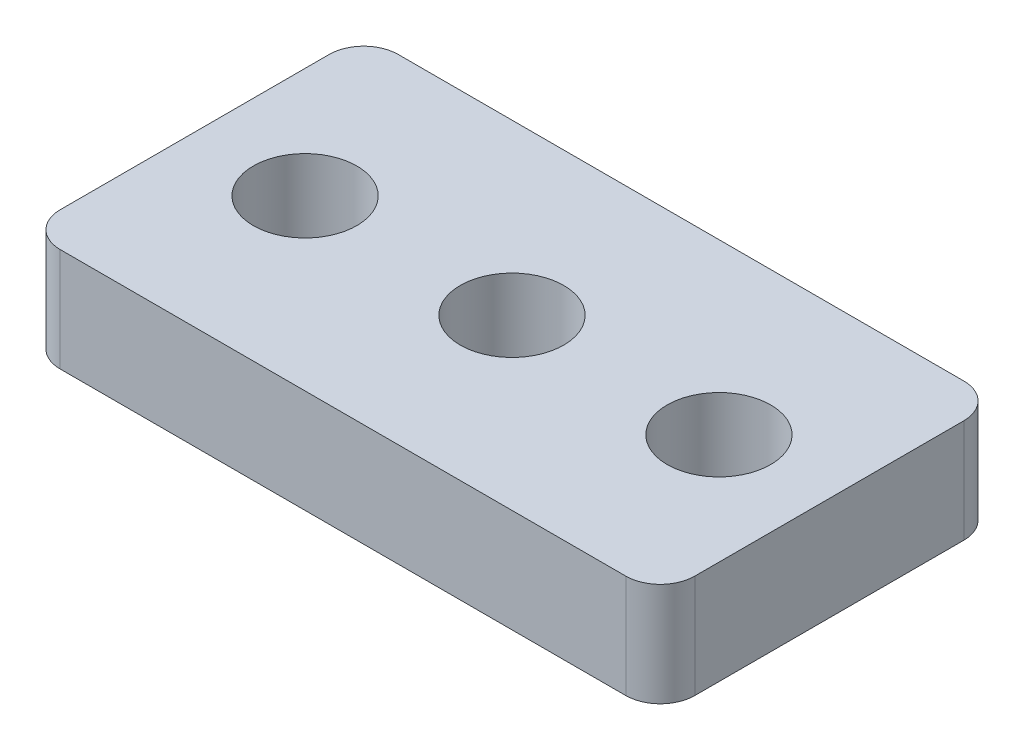
ISO-10303-21;
HEADER;
FILE_DESCRIPTION(('STEP AP214'),'2;1');
FILE_NAME('part.step','',(''),(''),'','','');
FILE_SCHEMA(('AUTOMOTIVE_DESIGN { 1 0 10303 214 1 1 1 1 }'));
ENDSEC;
DATA;
#1=APPLICATION_CONTEXT('core data for automotive mechanical design processes');
#2=APPLICATION_PROTOCOL_DEFINITION('international standard','automotive_design',2000,#1);
#3=PRODUCT_CONTEXT('',#1,'mechanical');
#4=PRODUCT('Part','Part','',(#3));
#5=PRODUCT_RELATED_PRODUCT_CATEGORY('part','',(#4));
#6=PRODUCT_DEFINITION_FORMATION('','',#4);
#7=PRODUCT_DEFINITION_CONTEXT('part definition',#1,'design');
#8=PRODUCT_DEFINITION('design','',#6,#7);
#9=PRODUCT_DEFINITION_SHAPE('','',#8);
#10=(LENGTH_UNIT() NAMED_UNIT(*) SI_UNIT(.MILLI.,.METRE.));
#11=(NAMED_UNIT(*) PLANE_ANGLE_UNIT() SI_UNIT($,.RADIAN.));
#12=(NAMED_UNIT(*) SI_UNIT($,.STERADIAN.) SOLID_ANGLE_UNIT());
#13=UNCERTAINTY_MEASURE_WITH_UNIT(LENGTH_MEASURE(1.E-05),#10,'distance_accuracy_value','');
#14=(GEOMETRIC_REPRESENTATION_CONTEXT(3) GLOBAL_UNCERTAINTY_ASSIGNED_CONTEXT((#13)) GLOBAL_UNIT_ASSIGNED_CONTEXT((#10,
#11,#12)) REPRESENTATION_CONTEXT('',''));
#15=CARTESIAN_POINT('',(0.,0.,0.));
#16=DIRECTION('',(0.,0.,1.));
#17=DIRECTION('',(1.,0.,0.));
#18=AXIS2_PLACEMENT_3D('',#15,#16,#17);
#19=CARTESIAN_POINT('',(0.,3.,0.));
#20=DIRECTION('',(0.,1.,0.));
#21=DIRECTION('',(0.,0.,1.));
#22=AXIS2_PLACEMENT_3D('',#19,#20,#21);
#23=PLANE('',#22);
#24=CARTESIAN_POINT('',(0.,3.,0.));
#25=DIRECTION('',(0.,1.,0.));
#26=DIRECTION('',(0.,0.,1.));
#27=AXIS2_PLACEMENT_3D('',#24,#25,#26);
#28=CIRCLE('',#27,1.5);
#29=CARTESIAN_POINT('',(0.,3.,1.5));
#30=VERTEX_POINT('',#29);
#31=EDGE_CURVE('E186',#30,#30,#28,.T.);
#32=ORIENTED_EDGE('',*,*,#31,.F.);
#33=EDGE_LOOP('',(#32));
#34=FACE_BOUND('',#33,.T.);
#35=DIRECTION('',(0.,0.,1.));
#36=VECTOR('',#35,1.);
#37=CARTESIAN_POINT('',(-9.2,3.,-4.89999990463257));
#38=LINE('',#37,#36);
#39=CARTESIAN_POINT('',(-9.2,3.,-3.89999990463257));
#40=VERTEX_POINT('',#39);
#41=CARTESIAN_POINT('',(-9.2,3.,3.89999990463257));
#42=VERTEX_POINT('',#41);
#43=EDGE_CURVE('E172',#40,#42,#38,.T.);
#44=ORIENTED_EDGE('',*,*,#43,.T.);
#45=CARTESIAN_POINT('',(-8.2,3.,3.89999990463257));
#46=DIRECTION('',(0.,1.,0.));
#47=DIRECTION('',(0.,0.,1.));
#48=AXIS2_PLACEMENT_3D('',#45,#46,#47);
#49=CIRCLE('',#48,1.);
#50=CARTESIAN_POINT('',(-8.2,3.,4.89999990463257));
#51=VERTEX_POINT('',#50);
#52=EDGE_CURVE('E153',#42,#51,#49,.T.);
#53=ORIENTED_EDGE('',*,*,#52,.T.);
#54=DIRECTION('',(1.,0.,0.));
#55=VECTOR('',#54,1.);
#56=CARTESIAN_POINT('',(-9.2,3.,4.89999990463257));
#57=LINE('',#56,#55);
#58=CARTESIAN_POINT('',(8.2,3.,4.89999990463257));
#59=VERTEX_POINT('',#58);
#60=EDGE_CURVE('E123',#51,#59,#57,.T.);
#61=ORIENTED_EDGE('',*,*,#60,.T.);
#62=CARTESIAN_POINT('',(8.2,3.,3.89999990463257));
#63=DIRECTION('',(0.,1.,0.));
#64=DIRECTION('',(0.,0.,1.));
#65=AXIS2_PLACEMENT_3D('',#62,#63,#64);
#66=CIRCLE('',#65,1.);
#67=CARTESIAN_POINT('',(9.2,3.,3.89999990463257));
#68=VERTEX_POINT('',#67);
#69=EDGE_CURVE('E59',#59,#68,#66,.T.);
#70=ORIENTED_EDGE('',*,*,#69,.T.);
#71=DIRECTION('',(0.,0.,-1.));
#72=VECTOR('',#71,1.);
#73=CARTESIAN_POINT('',(9.2,3.,4.89999990463257));
#74=LINE('',#73,#72);
#75=CARTESIAN_POINT('',(9.2,3.,-3.89999990463256));
#76=VERTEX_POINT('',#75);
#77=EDGE_CURVE('E139',#68,#76,#74,.T.);
#78=ORIENTED_EDGE('',*,*,#77,.T.);
#79=CARTESIAN_POINT('',(8.2,3.,-3.89999990463257));
#80=DIRECTION('',(0.,1.,0.));
#81=DIRECTION('',(0.,0.,1.));
#82=AXIS2_PLACEMENT_3D('',#79,#80,#81);
#83=CIRCLE('',#82,1.);
#84=CARTESIAN_POINT('',(8.2,3.,-4.89999990463257));
#85=VERTEX_POINT('',#84);
#86=EDGE_CURVE('E150',#76,#85,#83,.T.);
#87=ORIENTED_EDGE('',*,*,#86,.T.);
#88=DIRECTION('',(-1.,0.,0.));
#89=VECTOR('',#88,1.);
#90=CARTESIAN_POINT('',(9.2,3.,-4.89999990463257));
#91=LINE('',#90,#89);
#92=CARTESIAN_POINT('',(-8.2,3.,-4.89999990463257));
#93=VERTEX_POINT('',#92);
#94=EDGE_CURVE('E133',#85,#93,#91,.T.);
#95=ORIENTED_EDGE('',*,*,#94,.T.);
#96=CARTESIAN_POINT('',(-8.2,3.,-3.89999990463257));
#97=DIRECTION('',(0.,1.,0.));
#98=DIRECTION('',(0.,0.,1.));
#99=AXIS2_PLACEMENT_3D('',#96,#97,#98);
#100=CIRCLE('',#99,1.);
#101=EDGE_CURVE('E148',#93,#40,#100,.T.);
#102=ORIENTED_EDGE('',*,*,#101,.T.);
#103=EDGE_LOOP('',(#44,#53,#61,#70,#78,#87,#95,#102));
#104=FACE_BOUND('',#103,.T.);
#105=CARTESIAN_POINT('',(6.0000007,3.,0.));
#106=DIRECTION('',(0.,1.,0.));
#107=DIRECTION('',(0.,0.,1.));
#108=AXIS2_PLACEMENT_3D('',#105,#106,#107);
#109=CIRCLE('',#108,1.5);
#110=CARTESIAN_POINT('',(6.0000007,3.,1.5));
#111=VERTEX_POINT('',#110);
#112=EDGE_CURVE('E177',#111,#111,#109,.T.);
#113=ORIENTED_EDGE('',*,*,#112,.F.);
#114=EDGE_LOOP('',(#113));
#115=FACE_BOUND('',#114,.T.);
#116=CARTESIAN_POINT('',(-6.0000007,3.,0.));
#117=DIRECTION('',(0.,1.,0.));
#118=DIRECTION('',(0.,0.,1.));
#119=AXIS2_PLACEMENT_3D('',#116,#117,#118);
#120=CIRCLE('',#119,1.5);
#121=CARTESIAN_POINT('',(-6.0000007,3.,1.5));
#122=VERTEX_POINT('',#121);
#123=EDGE_CURVE('E191',#122,#122,#120,.T.);
#124=ORIENTED_EDGE('',*,*,#123,.F.);
#125=EDGE_LOOP('',(#124));
#126=FACE_BOUND('',#125,.T.);
#127=ADVANCED_FACE('F37',(#34,#104,#115,#126),#23,.T.);
#128=CARTESIAN_POINT('',(0.,0.,0.));
#129=DIRECTION('',(0.,1.,0.));
#130=DIRECTION('',(0.,0.,1.));
#131=AXIS2_PLACEMENT_3D('',#128,#129,#130);
#132=PLANE('',#131);
#133=DIRECTION('',(1.,0.,0.));
#134=VECTOR('',#133,1.);
#135=CARTESIAN_POINT('',(-9.2,0.,4.89999990463257));
#136=LINE('',#135,#134);
#137=CARTESIAN_POINT('',(-8.2,0.,4.89999990463257));
#138=VERTEX_POINT('',#137);
#139=CARTESIAN_POINT('',(8.2,0.,4.89999990463257));
#140=VERTEX_POINT('',#139);
#141=EDGE_CURVE('E121',#138,#140,#136,.T.);
#142=ORIENTED_EDGE('',*,*,#141,.F.);
#143=CARTESIAN_POINT('',(-8.2,0.,3.89999990463257));
#144=DIRECTION('',(0.,1.,0.));
#145=DIRECTION('',(0.,0.,1.));
#146=AXIS2_PLACEMENT_3D('',#143,#144,#145);
#147=CIRCLE('',#146,1.);
#148=CARTESIAN_POINT('',(-9.2,0.,3.89999990463257));
#149=VERTEX_POINT('',#148);
#150=EDGE_CURVE('E104',#138,#149,#147,.F.);
#151=ORIENTED_EDGE('',*,*,#150,.T.);
#152=DIRECTION('',(0.,0.,1.));
#153=VECTOR('',#152,1.);
#154=CARTESIAN_POINT('',(-9.2,0.,-4.89999990463257));
#155=LINE('',#154,#153);
#156=CARTESIAN_POINT('',(-9.2,0.,-3.89999990463257));
#157=VERTEX_POINT('',#156);
#158=EDGE_CURVE('E131',#157,#149,#155,.T.);
#159=ORIENTED_EDGE('',*,*,#158,.F.);
#160=CARTESIAN_POINT('',(-8.2,0.,-3.89999990463257));
#161=DIRECTION('',(0.,1.,0.));
#162=DIRECTION('',(0.,0.,1.));
#163=AXIS2_PLACEMENT_3D('',#160,#161,#162);
#164=CIRCLE('',#163,1.);
#165=CARTESIAN_POINT('',(-8.2,0.,-4.89999990463257));
#166=VERTEX_POINT('',#165);
#167=EDGE_CURVE('E124',#157,#166,#164,.F.);
#168=ORIENTED_EDGE('',*,*,#167,.T.);
#169=DIRECTION('',(-1.,0.,0.));
#170=VECTOR('',#169,1.);
#171=CARTESIAN_POINT('',(9.2,0.,-4.89999990463257));
#172=LINE('',#171,#170);
#173=CARTESIAN_POINT('',(8.2,0.,-4.89999990463257));
#174=VERTEX_POINT('',#173);
#175=EDGE_CURVE('E135',#174,#166,#172,.T.);
#176=ORIENTED_EDGE('',*,*,#175,.F.);
#177=CARTESIAN_POINT('',(8.2,0.,-3.89999990463257));
#178=DIRECTION('',(0.,1.,0.));
#179=DIRECTION('',(0.,0.,1.));
#180=AXIS2_PLACEMENT_3D('',#177,#178,#179);
#181=CIRCLE('',#180,1.);
#182=CARTESIAN_POINT('',(9.2,0.,-3.89999990463256));
#183=VERTEX_POINT('',#182);
#184=EDGE_CURVE('E142',#174,#183,#181,.F.);
#185=ORIENTED_EDGE('',*,*,#184,.T.);
#186=DIRECTION('',(0.,0.,-1.));
#187=VECTOR('',#186,1.);
#188=CARTESIAN_POINT('',(9.2,0.,4.89999990463257));
#189=LINE('',#188,#187);
#190=CARTESIAN_POINT('',(9.2,0.,3.89999990463257));
#191=VERTEX_POINT('',#190);
#192=EDGE_CURVE('E130',#191,#183,#189,.T.);
#193=ORIENTED_EDGE('',*,*,#192,.F.);
#194=CARTESIAN_POINT('',(8.2,0.,3.89999990463257));
#195=DIRECTION('',(0.,1.,0.));
#196=DIRECTION('',(0.,0.,1.));
#197=AXIS2_PLACEMENT_3D('',#194,#195,#196);
#198=CIRCLE('',#197,1.);
#199=EDGE_CURVE('E115',#191,#140,#198,.F.);
#200=ORIENTED_EDGE('',*,*,#199,.T.);
#201=EDGE_LOOP('',(#142,#151,#159,#168,#176,#185,#193,#200));
#202=FACE_BOUND('',#201,.T.);
#203=CARTESIAN_POINT('',(6.0000007,0.,0.));
#204=DIRECTION('',(0.,1.,0.));
#205=DIRECTION('',(0.,0.,1.));
#206=AXIS2_PLACEMENT_3D('',#203,#204,#205);
#207=CIRCLE('',#206,1.5);
#208=CARTESIAN_POINT('',(6.0000007,0.,1.5));
#209=VERTEX_POINT('',#208);
#210=EDGE_CURVE('E179',#209,#209,#207,.T.);
#211=ORIENTED_EDGE('',*,*,#210,.T.);
#212=EDGE_LOOP('',(#211));
#213=FACE_BOUND('',#212,.T.);
#214=CARTESIAN_POINT('',(0.,0.,0.));
#215=DIRECTION('',(0.,1.,0.));
#216=DIRECTION('',(0.,0.,1.));
#217=AXIS2_PLACEMENT_3D('',#214,#215,#216);
#218=CIRCLE('',#217,1.5);
#219=CARTESIAN_POINT('',(0.,0.,1.5));
#220=VERTEX_POINT('',#219);
#221=EDGE_CURVE('E188',#220,#220,#218,.T.);
#222=ORIENTED_EDGE('',*,*,#221,.T.);
#223=EDGE_LOOP('',(#222));
#224=FACE_BOUND('',#223,.T.);
#225=CARTESIAN_POINT('',(-6.0000007,0.,0.));
#226=DIRECTION('',(0.,1.,0.));
#227=DIRECTION('',(0.,0.,1.));
#228=AXIS2_PLACEMENT_3D('',#225,#226,#227);
#229=CIRCLE('',#228,1.5);
#230=CARTESIAN_POINT('',(-6.0000007,0.,1.5));
#231=VERTEX_POINT('',#230);
#232=EDGE_CURVE('E194',#231,#231,#229,.T.);
#233=ORIENTED_EDGE('',*,*,#232,.T.);
#234=EDGE_LOOP('',(#233));
#235=FACE_BOUND('',#234,.T.);
#236=ADVANCED_FACE('F127',(#202,#213,#224,#235),#132,.F.);
#237=CARTESIAN_POINT('',(9.2,3.,-4.89999990463257));
#238=DIRECTION('',(0.,0.,1.));
#239=DIRECTION('',(1.,0.,0.));
#240=AXIS2_PLACEMENT_3D('',#237,#238,#239);
#241=PLANE('',#240);
#242=ORIENTED_EDGE('',*,*,#94,.F.);
#243=DIRECTION('',(0.,-1.,0.));
#244=VECTOR('',#243,1.);
#245=CARTESIAN_POINT('',(8.2,3.,-4.89999990463257));
#246=LINE('',#245,#244);
#247=EDGE_CURVE('E11',#85,#174,#246,.T.);
#248=ORIENTED_EDGE('',*,*,#247,.T.);
#249=ORIENTED_EDGE('',*,*,#175,.T.);
#250=DIRECTION('',(0.,-1.,0.));
#251=VECTOR('',#250,1.);
#252=CARTESIAN_POINT('',(-8.2,3.,-4.89999990463257));
#253=LINE('',#252,#251);
#254=EDGE_CURVE('E45',#166,#93,#253,.F.);
#255=ORIENTED_EDGE('',*,*,#254,.T.);
#256=EDGE_LOOP('',(#242,#248,#249,#255));
#257=FACE_BOUND('',#256,.T.);
#258=ADVANCED_FACE('F163',(#257),#241,.F.);
#259=CARTESIAN_POINT('',(-9.2,3.,-4.89999990463257));
#260=DIRECTION('',(1.,0.,0.));
#261=DIRECTION('',(0.,0.,-1.));
#262=AXIS2_PLACEMENT_3D('',#259,#260,#261);
#263=PLANE('',#262);
#264=ORIENTED_EDGE('',*,*,#158,.T.);
#265=DIRECTION('',(0.,-1.,0.));
#266=VECTOR('',#265,1.);
#267=CARTESIAN_POINT('',(-9.2,3.,3.89999990463257));
#268=LINE('',#267,#266);
#269=EDGE_CURVE('E109',#149,#42,#268,.F.);
#270=ORIENTED_EDGE('',*,*,#269,.T.);
#271=ORIENTED_EDGE('',*,*,#43,.F.);
#272=DIRECTION('',(0.,-1.,0.));
#273=VECTOR('',#272,1.);
#274=CARTESIAN_POINT('',(-9.2,3.,-3.89999990463257));
#275=LINE('',#274,#273);
#276=EDGE_CURVE('E114',#40,#157,#275,.T.);
#277=ORIENTED_EDGE('',*,*,#276,.T.);
#278=EDGE_LOOP('',(#264,#270,#271,#277));
#279=FACE_BOUND('',#278,.T.);
#280=ADVANCED_FACE('F176',(#279),#263,.F.);
#281=CARTESIAN_POINT('',(-9.2,3.,4.89999990463257));
#282=DIRECTION('',(0.,0.,-1.));
#283=DIRECTION('',(-1.,0.,0.));
#284=AXIS2_PLACEMENT_3D('',#281,#282,#283);
#285=PLANE('',#284);
#286=ORIENTED_EDGE('',*,*,#60,.F.);
#287=DIRECTION('',(0.,-1.,0.));
#288=VECTOR('',#287,1.);
#289=CARTESIAN_POINT('',(-8.2,3.,4.89999990463257));
#290=LINE('',#289,#288);
#291=EDGE_CURVE('E108',#51,#138,#290,.T.);
#292=ORIENTED_EDGE('',*,*,#291,.T.);
#293=ORIENTED_EDGE('',*,*,#141,.T.);
#294=DIRECTION('',(0.,-1.,0.));
#295=VECTOR('',#294,1.);
#296=CARTESIAN_POINT('',(8.2,3.,4.89999990463257));
#297=LINE('',#296,#295);
#298=EDGE_CURVE('E125',#140,#59,#297,.F.);
#299=ORIENTED_EDGE('',*,*,#298,.T.);
#300=EDGE_LOOP('',(#286,#292,#293,#299));
#301=FACE_BOUND('',#300,.T.);
#302=ADVANCED_FACE('F120',(#301),#285,.F.);
#303=CARTESIAN_POINT('',(9.2,3.,4.89999990463257));
#304=DIRECTION('',(-1.,0.,0.));
#305=DIRECTION('',(0.,0.,1.));
#306=AXIS2_PLACEMENT_3D('',#303,#304,#305);
#307=PLANE('',#306);
#308=ORIENTED_EDGE('',*,*,#77,.F.);
#309=DIRECTION('',(0.,-1.,0.));
#310=VECTOR('',#309,1.);
#311=CARTESIAN_POINT('',(9.2,3.,3.89999990463257));
#312=LINE('',#311,#310);
#313=EDGE_CURVE('E156',#68,#191,#312,.T.);
#314=ORIENTED_EDGE('',*,*,#313,.T.);
#315=ORIENTED_EDGE('',*,*,#192,.T.);
#316=DIRECTION('',(0.,-1.,0.));
#317=VECTOR('',#316,1.);
#318=CARTESIAN_POINT('',(9.2,3.,-3.89999990463256));
#319=LINE('',#318,#317);
#320=EDGE_CURVE('E52',#183,#76,#319,.F.);
#321=ORIENTED_EDGE('',*,*,#320,.T.);
#322=EDGE_LOOP('',(#308,#314,#315,#321));
#323=FACE_BOUND('',#322,.T.);
#324=ADVANCED_FACE('F215',(#323),#307,.F.);
#325=CARTESIAN_POINT('',(6.0000007,3.,0.));
#326=DIRECTION('',(0.,-1.,0.));
#327=DIRECTION('',(0.,0.,-1.));
#328=AXIS2_PLACEMENT_3D('',#325,#326,#327);
#329=CYLINDRICAL_SURFACE('',#328,1.5);
#330=ORIENTED_EDGE('',*,*,#112,.T.);
#331=EDGE_LOOP('',(#330));
#332=FACE_BOUND('',#331,.T.);
#333=ORIENTED_EDGE('',*,*,#210,.F.);
#334=EDGE_LOOP('',(#333));
#335=FACE_BOUND('',#334,.T.);
#336=ADVANCED_FACE('F212',(#332,#335),#329,.F.);
#337=CARTESIAN_POINT('',(0.,3.,0.));
#338=DIRECTION('',(0.,-1.,0.));
#339=DIRECTION('',(0.,0.,-1.));
#340=AXIS2_PLACEMENT_3D('',#337,#338,#339);
#341=CYLINDRICAL_SURFACE('',#340,1.5);
#342=ORIENTED_EDGE('',*,*,#31,.T.);
#343=EDGE_LOOP('',(#342));
#344=FACE_BOUND('',#343,.T.);
#345=ORIENTED_EDGE('',*,*,#221,.F.);
#346=EDGE_LOOP('',(#345));
#347=FACE_BOUND('',#346,.T.);
#348=ADVANCED_FACE('F298',(#344,#347),#341,.F.);
#349=CARTESIAN_POINT('',(-6.0000007,3.,0.));
#350=DIRECTION('',(0.,-1.,0.));
#351=DIRECTION('',(0.,0.,-1.));
#352=AXIS2_PLACEMENT_3D('',#349,#350,#351);
#353=CYLINDRICAL_SURFACE('',#352,1.5);
#354=ORIENTED_EDGE('',*,*,#123,.T.);
#355=EDGE_LOOP('',(#354));
#356=FACE_BOUND('',#355,.T.);
#357=ORIENTED_EDGE('',*,*,#232,.F.);
#358=EDGE_LOOP('',(#357));
#359=FACE_BOUND('',#358,.T.);
#360=ADVANCED_FACE('F200',(#356,#359),#353,.F.);
#361=CARTESIAN_POINT('',(-8.2,3.,3.89999990463257));
#362=DIRECTION('',(0.,-1.,0.));
#363=DIRECTION('',(0.,0.,-1.));
#364=AXIS2_PLACEMENT_3D('',#361,#362,#363);
#365=CYLINDRICAL_SURFACE('',#364,1.);
#366=ORIENTED_EDGE('',*,*,#52,.F.);
#367=ORIENTED_EDGE('',*,*,#269,.F.);
#368=ORIENTED_EDGE('',*,*,#150,.F.);
#369=ORIENTED_EDGE('',*,*,#291,.F.);
#370=EDGE_LOOP('',(#366,#367,#368,#369));
#371=FACE_BOUND('',#370,.T.);
#372=ADVANCED_FACE('F107',(#371),#365,.T.);
#373=CARTESIAN_POINT('',(8.2,3.,3.89999990463257));
#374=DIRECTION('',(0.,-1.,0.));
#375=DIRECTION('',(0.,0.,-1.));
#376=AXIS2_PLACEMENT_3D('',#373,#374,#375);
#377=CYLINDRICAL_SURFACE('',#376,1.);
#378=ORIENTED_EDGE('',*,*,#69,.F.);
#379=ORIENTED_EDGE('',*,*,#298,.F.);
#380=ORIENTED_EDGE('',*,*,#199,.F.);
#381=ORIENTED_EDGE('',*,*,#313,.F.);
#382=EDGE_LOOP('',(#378,#379,#380,#381));
#383=FACE_BOUND('',#382,.T.);
#384=ADVANCED_FACE('F226',(#383),#377,.T.);
#385=CARTESIAN_POINT('',(8.2,3.,-3.89999990463257));
#386=DIRECTION('',(0.,-1.,0.));
#387=DIRECTION('',(0.,0.,-1.));
#388=AXIS2_PLACEMENT_3D('',#385,#386,#387);
#389=CYLINDRICAL_SURFACE('',#388,1.);
#390=ORIENTED_EDGE('',*,*,#86,.F.);
#391=ORIENTED_EDGE('',*,*,#320,.F.);
#392=ORIENTED_EDGE('',*,*,#184,.F.);
#393=ORIENTED_EDGE('',*,*,#247,.F.);
#394=EDGE_LOOP('',(#390,#391,#392,#393));
#395=FACE_BOUND('',#394,.T.);
#396=ADVANCED_FACE('F228',(#395),#389,.T.);
#397=CARTESIAN_POINT('',(-8.2,3.,-3.89999990463257));
#398=DIRECTION('',(0.,-1.,0.));
#399=DIRECTION('',(0.,0.,-1.));
#400=AXIS2_PLACEMENT_3D('',#397,#398,#399);
#401=CYLINDRICAL_SURFACE('',#400,1.);
#402=ORIENTED_EDGE('',*,*,#101,.F.);
#403=ORIENTED_EDGE('',*,*,#254,.F.);
#404=ORIENTED_EDGE('',*,*,#167,.F.);
#405=ORIENTED_EDGE('',*,*,#276,.F.);
#406=EDGE_LOOP('',(#402,#403,#404,#405));
#407=FACE_BOUND('',#406,.T.);
#408=ADVANCED_FACE('F39',(#407),#401,.T.);
#409=CLOSED_SHELL('',(#127,#236,#258,#280,#302,#324,#336,#348,#360,#372,#384,#396,#408));
#410=MANIFOLD_SOLID_BREP('B2',#409);
#411=ADVANCED_BREP_SHAPE_REPRESENTATION('',(#18,#410),#14);
#412=SHAPE_DEFINITION_REPRESENTATION(#9,#411);
ENDSEC;
END-ISO-10303-21;
